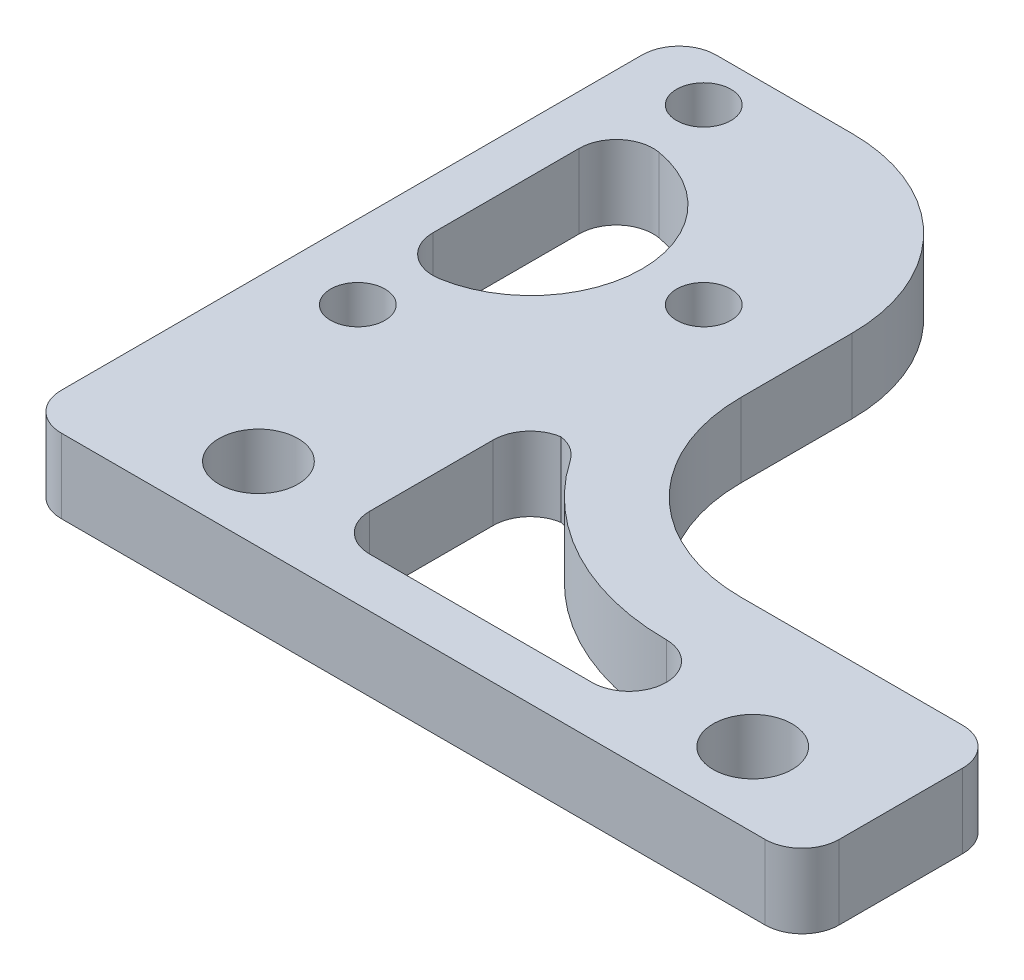
ISO-10303-21;
HEADER;
FILE_DESCRIPTION(('STEP AP214'),'2;1');
FILE_NAME('part.step','',(''),(''),'','','');
FILE_SCHEMA(('AUTOMOTIVE_DESIGN { 1 0 10303 214 1 1 1 1 }'));
ENDSEC;
DATA;
#1=APPLICATION_CONTEXT('core data for automotive mechanical design processes');
#2=APPLICATION_PROTOCOL_DEFINITION('international standard','automotive_design',2000,#1);
#3=PRODUCT_CONTEXT('',#1,'mechanical');
#4=PRODUCT('Part','Part','',(#3));
#5=PRODUCT_RELATED_PRODUCT_CATEGORY('part','',(#4));
#6=PRODUCT_DEFINITION_FORMATION('','',#4);
#7=PRODUCT_DEFINITION_CONTEXT('part definition',#1,'design');
#8=PRODUCT_DEFINITION('design','',#6,#7);
#9=PRODUCT_DEFINITION_SHAPE('','',#8);
#10=(LENGTH_UNIT() NAMED_UNIT(*) SI_UNIT(.MILLI.,.METRE.));
#11=(NAMED_UNIT(*) PLANE_ANGLE_UNIT() SI_UNIT($,.RADIAN.));
#12=(NAMED_UNIT(*) SI_UNIT($,.STERADIAN.) SOLID_ANGLE_UNIT());
#13=UNCERTAINTY_MEASURE_WITH_UNIT(LENGTH_MEASURE(1.E-05),#10,'distance_accuracy_value','');
#14=(GEOMETRIC_REPRESENTATION_CONTEXT(3) GLOBAL_UNCERTAINTY_ASSIGNED_CONTEXT((#13)) GLOBAL_UNIT_ASSIGNED_CONTEXT((#10,
#11,#12)) REPRESENTATION_CONTEXT('',''));
#15=CARTESIAN_POINT('',(0.,0.,0.));
#16=DIRECTION('',(0.,0.,1.));
#17=DIRECTION('',(1.,0.,0.));
#18=AXIS2_PLACEMENT_3D('',#15,#16,#17);
#19=CARTESIAN_POINT('',(0.,3.,0.));
#20=DIRECTION('',(0.,1.,0.));
#21=DIRECTION('',(0.,0.,1.));
#22=AXIS2_PLACEMENT_3D('',#19,#20,#21);
#23=PLANE('',#22);
#24=DIRECTION('',(0.,0.,1.));
#25=VECTOR('',#24,1.);
#26=CARTESIAN_POINT('',(7.48,3.,7.5));
#27=LINE('',#26,#25);
#28=CARTESIAN_POINT('',(7.48,3.,9.));
#29=VERTEX_POINT('',#28);
#30=CARTESIAN_POINT('',(7.48,3.,14.));
#31=VERTEX_POINT('',#30);
#32=EDGE_CURVE('E711',#29,#31,#27,.T.);
#33=ORIENTED_EDGE('',*,*,#32,.F.);
#34=CARTESIAN_POINT('',(8.98,3.,9.));
#35=DIRECTION('',(0.,1.,0.));
#36=DIRECTION('',(0.,0.,1.));
#37=AXIS2_PLACEMENT_3D('',#34,#35,#36);
#38=CIRCLE('',#37,1.5);
#39=CARTESIAN_POINT('',(8.74658350974743,3.,7.51827237925515));
#40=VERTEX_POINT('',#39);
#41=EDGE_CURVE('E53',#29,#40,#38,.F.);
#42=ORIENTED_EDGE('',*,*,#41,.T.);
#43=CARTESIAN_POINT('',(8.51316701949486,3.,9.));
#44=DIRECTION('',(0.,1.,0.));
#45=DIRECTION('',(0.,0.,1.));
#46=AXIS2_PLACEMENT_3D('',#43,#44,#45);
#47=CIRCLE('',#46,1.5);
#48=CARTESIAN_POINT('',(9.75058001695206,3.,8.15217391304348));
#49=VERTEX_POINT('',#48);
#50=EDGE_CURVE('E298',#40,#49,#47,.F.);
#51=ORIENTED_EDGE('',*,*,#50,.T.);
#52=CARTESIAN_POINT('',(18.,3.,2.5));
#53=DIRECTION('',(0.,-1.,0.));
#54=DIRECTION('',(0.,0.,1.));
#55=AXIS2_PLACEMENT_3D('',#52,#53,#54);
#56=CIRCLE('',#55,10.);
#57=CARTESIAN_POINT('',(17.9826086956522,3.,12.4999848771152));
#58=VERTEX_POINT('',#57);
#59=EDGE_CURVE('E258',#58,#49,#56,.T.);
#60=ORIENTED_EDGE('',*,*,#59,.F.);
#61=CARTESIAN_POINT('',(17.98,3.,13.9999826086825));
#62=DIRECTION('',(0.,1.,0.));
#63=DIRECTION('',(0.,0.,1.));
#64=AXIS2_PLACEMENT_3D('',#61,#62,#63);
#65=CIRCLE('',#64,1.5);
#66=CARTESIAN_POINT('',(19.48,3.,13.9999826086825));
#67=VERTEX_POINT('',#66);
#68=EDGE_CURVE('E315',#58,#67,#65,.F.);
#69=ORIENTED_EDGE('',*,*,#68,.T.);
#70=DIRECTION('',(0.,0.,-1.));
#71=VECTOR('',#70,1.);
#72=CARTESIAN_POINT('',(19.48,3.,15.5));
#73=LINE('',#72,#71);
#74=CARTESIAN_POINT('',(19.48,3.,14.));
#75=VERTEX_POINT('',#74);
#76=EDGE_CURVE('E703',#75,#67,#73,.T.);
#77=ORIENTED_EDGE('',*,*,#76,.F.);
#78=CARTESIAN_POINT('',(17.98,3.,14.));
#79=DIRECTION('',(0.,1.,0.));
#80=DIRECTION('',(0.,0.,1.));
#81=AXIS2_PLACEMENT_3D('',#78,#79,#80);
#82=CIRCLE('',#81,1.5);
#83=CARTESIAN_POINT('',(17.98,3.,15.5));
#84=VERTEX_POINT('',#83);
#85=EDGE_CURVE('E314',#75,#84,#82,.F.);
#86=ORIENTED_EDGE('',*,*,#85,.T.);
#87=DIRECTION('',(1.,0.,0.));
#88=VECTOR('',#87,1.);
#89=CARTESIAN_POINT('',(7.48,3.,15.5));
#90=LINE('',#89,#88);
#91=CARTESIAN_POINT('',(8.98,3.,15.5));
#92=VERTEX_POINT('',#91);
#93=EDGE_CURVE('E707',#92,#84,#90,.T.);
#94=ORIENTED_EDGE('',*,*,#93,.F.);
#95=CARTESIAN_POINT('',(8.98,3.,14.));
#96=DIRECTION('',(0.,1.,0.));
#97=DIRECTION('',(0.,0.,1.));
#98=AXIS2_PLACEMENT_3D('',#95,#96,#97);
#99=CIRCLE('',#98,1.5);
#100=EDGE_CURVE('E299',#92,#31,#99,.F.);
#101=ORIENTED_EDGE('',*,*,#100,.T.);
#102=EDGE_LOOP('',(#33,#42,#51,#60,#69,#77,#86,#94,#101));
#103=FACE_BOUND('',#102,.T.);
#104=DIRECTION('',(0.,0.,-1.));
#105=VECTOR('',#104,1.);
#106=CARTESIAN_POINT('',(28.48,3.,-9.));
#107=LINE('',#106,#105);
#108=CARTESIAN_POINT('',(28.48,3.,16.));
#109=VERTEX_POINT('',#108);
#110=CARTESIAN_POINT('',(28.48,3.,11.));
#111=VERTEX_POINT('',#110);
#112=EDGE_CURVE('E359',#109,#111,#107,.T.);
#113=ORIENTED_EDGE('',*,*,#112,.T.);
#114=CARTESIAN_POINT('',(26.98,3.,11.));
#115=DIRECTION('',(0.,1.,0.));
#116=DIRECTION('',(0.,0.,1.));
#117=AXIS2_PLACEMENT_3D('',#114,#115,#116);
#118=CIRCLE('',#117,1.5);
#119=CARTESIAN_POINT('',(26.98,3.,9.5));
#120=VERTEX_POINT('',#119);
#121=EDGE_CURVE('E239',#111,#120,#118,.T.);
#122=ORIENTED_EDGE('',*,*,#121,.T.);
#123=DIRECTION('',(1.,0.,0.));
#124=VECTOR('',#123,1.);
#125=CARTESIAN_POINT('',(11.,3.,9.5));
#126=LINE('',#125,#124);
#127=CARTESIAN_POINT('',(18.,3.,9.5));
#128=VERTEX_POINT('',#127);
#129=EDGE_CURVE('E229',#128,#120,#126,.T.);
#130=ORIENTED_EDGE('',*,*,#129,.F.);
#131=CARTESIAN_POINT('',(18.,3.,2.5));
#132=DIRECTION('',(0.,1.,0.));
#133=DIRECTION('',(0.,0.,1.));
#134=AXIS2_PLACEMENT_3D('',#131,#132,#133);
#135=CIRCLE('',#134,7.);
#136=CARTESIAN_POINT('',(11.,3.,2.5));
#137=VERTEX_POINT('',#136);
#138=EDGE_CURVE('E211',#128,#137,#135,.F.);
#139=ORIENTED_EDGE('',*,*,#138,.T.);
#140=DIRECTION('',(0.,0.,1.));
#141=VECTOR('',#140,1.);
#142=CARTESIAN_POINT('',(11.,3.,-9.));
#143=LINE('',#142,#141);
#144=CARTESIAN_POINT('',(11.,3.,-2.));
#145=VERTEX_POINT('',#144);
#146=EDGE_CURVE('E242',#145,#137,#143,.T.);
#147=ORIENTED_EDGE('',*,*,#146,.F.);
#148=CARTESIAN_POINT('',(4.,3.,-2.));
#149=DIRECTION('',(0.,1.,0.));
#150=DIRECTION('',(0.,0.,1.));
#151=AXIS2_PLACEMENT_3D('',#148,#149,#150);
#152=CIRCLE('',#151,7.);
#153=CARTESIAN_POINT('',(4.,3.,-9.));
#154=VERTEX_POINT('',#153);
#155=EDGE_CURVE('E223',#145,#154,#152,.T.);
#156=ORIENTED_EDGE('',*,*,#155,.T.);
#157=DIRECTION('',(-1.,0.,0.));
#158=VECTOR('',#157,1.);
#159=CARTESIAN_POINT('',(-3.,3.,-9.));
#160=LINE('',#159,#158);
#161=CARTESIAN_POINT('',(-1.5,3.,-9.));
#162=VERTEX_POINT('',#161);
#163=EDGE_CURVE('E347',#154,#162,#160,.T.);
#164=ORIENTED_EDGE('',*,*,#163,.T.);
#165=CARTESIAN_POINT('',(-1.5,3.,-7.5));
#166=DIRECTION('',(0.,1.,0.));
#167=DIRECTION('',(0.,0.,1.));
#168=AXIS2_PLACEMENT_3D('',#165,#166,#167);
#169=CIRCLE('',#168,1.5);
#170=CARTESIAN_POINT('',(-3.,3.,-7.5));
#171=VERTEX_POINT('',#170);
#172=EDGE_CURVE('E504',#162,#171,#169,.T.);
#173=ORIENTED_EDGE('',*,*,#172,.T.);
#174=DIRECTION('',(0.,0.,1.));
#175=VECTOR('',#174,1.);
#176=CARTESIAN_POINT('',(-3.,3.,-9.));
#177=LINE('',#176,#175);
#178=CARTESIAN_POINT('',(-3.,3.,16.));
#179=VERTEX_POINT('',#178);
#180=EDGE_CURVE('E587',#171,#179,#177,.T.);
#181=ORIENTED_EDGE('',*,*,#180,.T.);
#182=CARTESIAN_POINT('',(-1.5,3.,16.));
#183=DIRECTION('',(0.,1.,0.));
#184=DIRECTION('',(0.,0.,1.));
#185=AXIS2_PLACEMENT_3D('',#182,#183,#184);
#186=CIRCLE('',#185,1.5);
#187=CARTESIAN_POINT('',(-1.5,3.,17.5));
#188=VERTEX_POINT('',#187);
#189=EDGE_CURVE('E507',#179,#188,#186,.T.);
#190=ORIENTED_EDGE('',*,*,#189,.T.);
#191=DIRECTION('',(1.,0.,0.));
#192=VECTOR('',#191,1.);
#193=CARTESIAN_POINT('',(-3.,3.,17.5));
#194=LINE('',#193,#192);
#195=CARTESIAN_POINT('',(26.98,3.,17.5));
#196=VERTEX_POINT('',#195);
#197=EDGE_CURVE('E591',#188,#196,#194,.T.);
#198=ORIENTED_EDGE('',*,*,#197,.T.);
#199=CARTESIAN_POINT('',(26.98,3.,16.));
#200=DIRECTION('',(0.,1.,0.));
#201=DIRECTION('',(0.,0.,1.));
#202=AXIS2_PLACEMENT_3D('',#199,#200,#201);
#203=CIRCLE('',#202,1.5);
#204=EDGE_CURVE('E501',#196,#109,#203,.T.);
#205=ORIENTED_EDGE('',*,*,#204,.T.);
#206=EDGE_LOOP('',(#113,#122,#130,#139,#147,#156,#164,#173,#181,#190,#198,#205));
#207=FACE_BOUND('',#206,.T.);
#208=CARTESIAN_POINT('',(0.,3.,0.));
#209=DIRECTION('',(0.,1.,0.));
#210=DIRECTION('',(0.,0.,1.));
#211=AXIS2_PLACEMENT_3D('',#208,#209,#210);
#212=CIRCLE('',#211,4.5);
#213=CARTESIAN_POINT('',(0.75,3.,4.43705983732471));
#214=VERTEX_POINT('',#213);
#215=CARTESIAN_POINT('',(0.75,3.,-4.43705983732471));
#216=VERTEX_POINT('',#215);
#217=EDGE_CURVE('E254',#214,#216,#212,.T.);
#218=ORIENTED_EDGE('',*,*,#217,.F.);
#219=CARTESIAN_POINT('',(0.5,3.,2.95803989154981));
#220=DIRECTION('',(0.,1.,0.));
#221=DIRECTION('',(0.,0.,1.));
#222=AXIS2_PLACEMENT_3D('',#219,#220,#221);
#223=CIRCLE('',#222,1.5);
#224=CARTESIAN_POINT('',(-1.,3.,2.95803989154981));
#225=VERTEX_POINT('',#224);
#226=EDGE_CURVE('E565',#214,#225,#223,.F.);
#227=ORIENTED_EDGE('',*,*,#226,.T.);
#228=DIRECTION('',(0.,0.,1.));
#229=VECTOR('',#228,1.);
#230=CARTESIAN_POINT('',(-1.,3.,-4.38748219369606));
#231=LINE('',#230,#229);
#232=CARTESIAN_POINT('',(-1.,3.,-2.95803989154981));
#233=VERTEX_POINT('',#232);
#234=EDGE_CURVE('E250',#233,#225,#231,.T.);
#235=ORIENTED_EDGE('',*,*,#234,.F.);
#236=CARTESIAN_POINT('',(0.5,3.,-2.95803989154981));
#237=DIRECTION('',(0.,1.,0.));
#238=DIRECTION('',(0.,0.,1.));
#239=AXIS2_PLACEMENT_3D('',#236,#237,#238);
#240=CIRCLE('',#239,1.5);
#241=EDGE_CURVE('E572',#233,#216,#240,.F.);
#242=ORIENTED_EDGE('',*,*,#241,.T.);
#243=EDGE_LOOP('',(#218,#227,#235,#242));
#244=FACE_BOUND('',#243,.T.);
#245=CARTESIAN_POINT('',(3.48,3.,14.5));
#246=DIRECTION('',(0.,1.,0.));
#247=DIRECTION('',(0.,0.,1.));
#248=AXIS2_PLACEMENT_3D('',#245,#246,#247);
#249=CIRCLE('',#248,1.6);
#250=CARTESIAN_POINT('',(3.48,3.,16.1));
#251=VERTEX_POINT('',#250);
#252=EDGE_CURVE('E635',#251,#251,#249,.T.);
#253=ORIENTED_EDGE('',*,*,#252,.F.);
#254=EDGE_LOOP('',(#253));
#255=FACE_BOUND('',#254,.T.);
#256=CARTESIAN_POINT('',(7.,3.,0.));
#257=DIRECTION('',(0.,1.,0.));
#258=DIRECTION('',(0.,0.,1.));
#259=AXIS2_PLACEMENT_3D('',#256,#257,#258);
#260=CIRCLE('',#259,1.1);
#261=CARTESIAN_POINT('',(7.,3.,1.1));
#262=VERTEX_POINT('',#261);
#263=EDGE_CURVE('E619',#262,#262,#260,.T.);
#264=ORIENTED_EDGE('',*,*,#263,.F.);
#265=EDGE_LOOP('',(#264));
#266=FACE_BOUND('',#265,.T.);
#267=CARTESIAN_POINT('',(0.,3.,-7.));
#268=DIRECTION('',(0.,1.,0.));
#269=DIRECTION('',(0.,0.,1.));
#270=AXIS2_PLACEMENT_3D('',#267,#268,#269);
#271=CIRCLE('',#270,1.1);
#272=CARTESIAN_POINT('',(0.,3.,-5.9));
#273=VERTEX_POINT('',#272);
#274=EDGE_CURVE('E608',#273,#273,#271,.T.);
#275=ORIENTED_EDGE('',*,*,#274,.F.);
#276=EDGE_LOOP('',(#275));
#277=FACE_BOUND('',#276,.T.);
#278=CARTESIAN_POINT('',(0.,3.,7.));
#279=DIRECTION('',(0.,1.,0.));
#280=DIRECTION('',(0.,0.,1.));
#281=AXIS2_PLACEMENT_3D('',#278,#279,#280);
#282=CIRCLE('',#281,1.1);
#283=CARTESIAN_POINT('',(0.,3.,8.1));
#284=VERTEX_POINT('',#283);
#285=EDGE_CURVE('E626',#284,#284,#282,.T.);
#286=ORIENTED_EDGE('',*,*,#285,.F.);
#287=EDGE_LOOP('',(#286));
#288=FACE_BOUND('',#287,.T.);
#289=CARTESIAN_POINT('',(23.48,3.,14.5));
#290=DIRECTION('',(0.,1.,0.));
#291=DIRECTION('',(0.,0.,1.));
#292=AXIS2_PLACEMENT_3D('',#289,#290,#291);
#293=CIRCLE('',#292,1.6);
#294=CARTESIAN_POINT('',(23.48,3.,16.1));
#295=VERTEX_POINT('',#294);
#296=EDGE_CURVE('E642',#295,#295,#293,.T.);
#297=ORIENTED_EDGE('',*,*,#296,.F.);
#298=EDGE_LOOP('',(#297));
#299=FACE_BOUND('',#298,.T.);
#300=ADVANCED_FACE('F43',(#103,#207,#244,#255,#266,#277,#288,#299),#23,.T.);
#301=CARTESIAN_POINT('',(0.,0.,0.));
#302=DIRECTION('',(0.,1.,0.));
#303=DIRECTION('',(0.,0.,1.));
#304=AXIS2_PLACEMENT_3D('',#301,#302,#303);
#305=PLANE('',#304);
#306=DIRECTION('',(0.,0.,-1.));
#307=VECTOR('',#306,1.);
#308=CARTESIAN_POINT('',(19.48,0.,0.));
#309=LINE('',#308,#307);
#310=CARTESIAN_POINT('',(19.48,0.,14.));
#311=VERTEX_POINT('',#310);
#312=CARTESIAN_POINT('',(19.48,0.,13.9999826086825));
#313=VERTEX_POINT('',#312);
#314=EDGE_CURVE('E474',#311,#313,#309,.T.);
#315=ORIENTED_EDGE('',*,*,#314,.T.);
#316=CARTESIAN_POINT('',(17.98,0.,13.9999826086825));
#317=DIRECTION('',(0.,1.,0.));
#318=DIRECTION('',(0.,0.,1.));
#319=AXIS2_PLACEMENT_3D('',#316,#317,#318);
#320=CIRCLE('',#319,1.5);
#321=CARTESIAN_POINT('',(17.9826086956522,0.,12.4999848771152));
#322=VERTEX_POINT('',#321);
#323=EDGE_CURVE('E309',#313,#322,#320,.T.);
#324=ORIENTED_EDGE('',*,*,#323,.T.);
#325=CARTESIAN_POINT('',(18.,0.,2.5));
#326=DIRECTION('',(0.,1.,0.));
#327=DIRECTION('',(0.,0.,1.));
#328=AXIS2_PLACEMENT_3D('',#325,#326,#327);
#329=CIRCLE('',#328,10.);
#330=CARTESIAN_POINT('',(9.75058001695206,0.,8.15217391304348));
#331=VERTEX_POINT('',#330);
#332=EDGE_CURVE('E463',#322,#331,#329,.F.);
#333=ORIENTED_EDGE('',*,*,#332,.T.);
#334=CARTESIAN_POINT('',(8.51316701949486,0.,9.));
#335=DIRECTION('',(0.,1.,0.));
#336=DIRECTION('',(0.,0.,1.));
#337=AXIS2_PLACEMENT_3D('',#334,#335,#336);
#338=CIRCLE('',#337,1.5);
#339=CARTESIAN_POINT('',(8.74658350974743,0.,7.51827237925515));
#340=VERTEX_POINT('',#339);
#341=EDGE_CURVE('E59',#331,#340,#338,.T.);
#342=ORIENTED_EDGE('',*,*,#341,.T.);
#343=CARTESIAN_POINT('',(8.98,0.,9.));
#344=DIRECTION('',(0.,1.,0.));
#345=DIRECTION('',(0.,0.,1.));
#346=AXIS2_PLACEMENT_3D('',#343,#344,#345);
#347=CIRCLE('',#346,1.5);
#348=CARTESIAN_POINT('',(7.48,0.,9.));
#349=VERTEX_POINT('',#348);
#350=EDGE_CURVE('E12',#340,#349,#347,.T.);
#351=ORIENTED_EDGE('',*,*,#350,.T.);
#352=DIRECTION('',(0.,0.,1.));
#353=VECTOR('',#352,1.);
#354=CARTESIAN_POINT('',(7.48,0.,0.));
#355=LINE('',#354,#353);
#356=CARTESIAN_POINT('',(7.48,0.,14.));
#357=VERTEX_POINT('',#356);
#358=EDGE_CURVE('E277',#349,#357,#355,.T.);
#359=ORIENTED_EDGE('',*,*,#358,.T.);
#360=CARTESIAN_POINT('',(8.98,0.,14.));
#361=DIRECTION('',(0.,1.,0.));
#362=DIRECTION('',(0.,0.,1.));
#363=AXIS2_PLACEMENT_3D('',#360,#361,#362);
#364=CIRCLE('',#363,1.5);
#365=CARTESIAN_POINT('',(8.98,0.,15.5));
#366=VERTEX_POINT('',#365);
#367=EDGE_CURVE('E293',#357,#366,#364,.T.);
#368=ORIENTED_EDGE('',*,*,#367,.T.);
#369=DIRECTION('',(1.,0.,0.));
#370=VECTOR('',#369,1.);
#371=CARTESIAN_POINT('',(0.,0.,15.5));
#372=LINE('',#371,#370);
#373=CARTESIAN_POINT('',(17.98,0.,15.5));
#374=VERTEX_POINT('',#373);
#375=EDGE_CURVE('E283',#366,#374,#372,.T.);
#376=ORIENTED_EDGE('',*,*,#375,.T.);
#377=CARTESIAN_POINT('',(17.98,0.,14.));
#378=DIRECTION('',(0.,1.,0.));
#379=DIRECTION('',(0.,0.,1.));
#380=AXIS2_PLACEMENT_3D('',#377,#378,#379);
#381=CIRCLE('',#380,1.5);
#382=EDGE_CURVE('E318',#374,#311,#381,.T.);
#383=ORIENTED_EDGE('',*,*,#382,.T.);
#384=EDGE_LOOP('',(#315,#324,#333,#342,#351,#359,#368,#376,#383));
#385=FACE_BOUND('',#384,.T.);
#386=CARTESIAN_POINT('',(0.,0.,0.));
#387=DIRECTION('',(0.,1.,0.));
#388=DIRECTION('',(0.,0.,1.));
#389=AXIS2_PLACEMENT_3D('',#386,#387,#388);
#390=CIRCLE('',#389,4.5);
#391=CARTESIAN_POINT('',(0.75,0.,4.43705983732471));
#392=VERTEX_POINT('',#391);
#393=CARTESIAN_POINT('',(0.75,0.,-4.43705983732471));
#394=VERTEX_POINT('',#393);
#395=EDGE_CURVE('E235',#392,#394,#390,.T.);
#396=ORIENTED_EDGE('',*,*,#395,.T.);
#397=CARTESIAN_POINT('',(0.5,0.,-2.95803989154981));
#398=DIRECTION('',(0.,1.,0.));
#399=DIRECTION('',(0.,0.,1.));
#400=AXIS2_PLACEMENT_3D('',#397,#398,#399);
#401=CIRCLE('',#400,1.5);
#402=CARTESIAN_POINT('',(-1.,0.,-2.95803989154981));
#403=VERTEX_POINT('',#402);
#404=EDGE_CURVE('E688',#394,#403,#401,.T.);
#405=ORIENTED_EDGE('',*,*,#404,.T.);
#406=DIRECTION('',(0.,0.,1.));
#407=VECTOR('',#406,1.);
#408=CARTESIAN_POINT('',(-1.,0.,0.));
#409=LINE('',#408,#407);
#410=CARTESIAN_POINT('',(-1.,0.,2.95803989154981));
#411=VERTEX_POINT('',#410);
#412=EDGE_CURVE('E329',#403,#411,#409,.T.);
#413=ORIENTED_EDGE('',*,*,#412,.T.);
#414=CARTESIAN_POINT('',(0.5,0.,2.95803989154981));
#415=DIRECTION('',(0.,1.,0.));
#416=DIRECTION('',(0.,0.,1.));
#417=AXIS2_PLACEMENT_3D('',#414,#415,#416);
#418=CIRCLE('',#417,1.5);
#419=EDGE_CURVE('E568',#411,#392,#418,.T.);
#420=ORIENTED_EDGE('',*,*,#419,.T.);
#421=EDGE_LOOP('',(#396,#405,#413,#420));
#422=FACE_BOUND('',#421,.T.);
#423=DIRECTION('',(1.,0.,0.));
#424=VECTOR('',#423,1.);
#425=CARTESIAN_POINT('',(0.,0.,9.5));
#426=LINE('',#425,#424);
#427=CARTESIAN_POINT('',(18.,0.,9.5));
#428=VERTEX_POINT('',#427);
#429=CARTESIAN_POINT('',(26.98,0.,9.5));
#430=VERTEX_POINT('',#429);
#431=EDGE_CURVE('E232',#428,#430,#426,.T.);
#432=ORIENTED_EDGE('',*,*,#431,.T.);
#433=CARTESIAN_POINT('',(26.98,0.,11.));
#434=DIRECTION('',(0.,1.,0.));
#435=DIRECTION('',(0.,0.,1.));
#436=AXIS2_PLACEMENT_3D('',#433,#434,#435);
#437=CIRCLE('',#436,1.5);
#438=CARTESIAN_POINT('',(28.48,0.,11.));
#439=VERTEX_POINT('',#438);
#440=EDGE_CURVE('E524',#430,#439,#437,.F.);
#441=ORIENTED_EDGE('',*,*,#440,.T.);
#442=DIRECTION('',(0.,0.,-1.));
#443=VECTOR('',#442,1.);
#444=CARTESIAN_POINT('',(28.48,0.,-9.));
#445=LINE('',#444,#443);
#446=CARTESIAN_POINT('',(28.48,0.,16.));
#447=VERTEX_POINT('',#446);
#448=EDGE_CURVE('E579',#447,#439,#445,.T.);
#449=ORIENTED_EDGE('',*,*,#448,.F.);
#450=CARTESIAN_POINT('',(26.98,0.,16.));
#451=DIRECTION('',(0.,1.,0.));
#452=DIRECTION('',(0.,0.,1.));
#453=AXIS2_PLACEMENT_3D('',#450,#451,#452);
#454=CIRCLE('',#453,1.5);
#455=CARTESIAN_POINT('',(26.98,0.,17.5));
#456=VERTEX_POINT('',#455);
#457=EDGE_CURVE('E515',#447,#456,#454,.F.);
#458=ORIENTED_EDGE('',*,*,#457,.T.);
#459=DIRECTION('',(1.,0.,0.));
#460=VECTOR('',#459,1.);
#461=CARTESIAN_POINT('',(-3.,0.,17.5));
#462=LINE('',#461,#460);
#463=CARTESIAN_POINT('',(-1.5,0.,17.5));
#464=VERTEX_POINT('',#463);
#465=EDGE_CURVE('E582',#464,#456,#462,.T.);
#466=ORIENTED_EDGE('',*,*,#465,.F.);
#467=CARTESIAN_POINT('',(-1.5,0.,16.));
#468=DIRECTION('',(0.,1.,0.));
#469=DIRECTION('',(0.,0.,1.));
#470=AXIS2_PLACEMENT_3D('',#467,#468,#469);
#471=CIRCLE('',#470,1.5);
#472=CARTESIAN_POINT('',(-3.,0.,16.));
#473=VERTEX_POINT('',#472);
#474=EDGE_CURVE('E521',#464,#473,#471,.F.);
#475=ORIENTED_EDGE('',*,*,#474,.T.);
#476=DIRECTION('',(0.,0.,1.));
#477=VECTOR('',#476,1.);
#478=CARTESIAN_POINT('',(-3.,0.,-9.));
#479=LINE('',#478,#477);
#480=CARTESIAN_POINT('',(-3.,0.,-7.5));
#481=VERTEX_POINT('',#480);
#482=EDGE_CURVE('E604',#481,#473,#479,.T.);
#483=ORIENTED_EDGE('',*,*,#482,.F.);
#484=CARTESIAN_POINT('',(-1.5,0.,-7.5));
#485=DIRECTION('',(0.,1.,0.));
#486=DIRECTION('',(0.,0.,1.));
#487=AXIS2_PLACEMENT_3D('',#484,#485,#486);
#488=CIRCLE('',#487,1.5);
#489=CARTESIAN_POINT('',(-1.5,0.,-9.));
#490=VERTEX_POINT('',#489);
#491=EDGE_CURVE('E518',#481,#490,#488,.F.);
#492=ORIENTED_EDGE('',*,*,#491,.T.);
#493=DIRECTION('',(-1.,0.,0.));
#494=VECTOR('',#493,1.);
#495=CARTESIAN_POINT('',(-3.,0.,-9.));
#496=LINE('',#495,#494);
#497=CARTESIAN_POINT('',(4.,0.,-9.));
#498=VERTEX_POINT('',#497);
#499=EDGE_CURVE('E366',#498,#490,#496,.T.);
#500=ORIENTED_EDGE('',*,*,#499,.F.);
#501=CARTESIAN_POINT('',(4.,0.,-2.));
#502=DIRECTION('',(0.,1.,0.));
#503=DIRECTION('',(0.,0.,1.));
#504=AXIS2_PLACEMENT_3D('',#501,#502,#503);
#505=CIRCLE('',#504,7.);
#506=CARTESIAN_POINT('',(11.,0.,-2.));
#507=VERTEX_POINT('',#506);
#508=EDGE_CURVE('E340',#498,#507,#505,.F.);
#509=ORIENTED_EDGE('',*,*,#508,.T.);
#510=DIRECTION('',(0.,0.,1.));
#511=VECTOR('',#510,1.);
#512=CARTESIAN_POINT('',(11.,0.,0.));
#513=LINE('',#512,#511);
#514=CARTESIAN_POINT('',(11.,0.,2.5));
#515=VERTEX_POINT('',#514);
#516=EDGE_CURVE('E241',#507,#515,#513,.T.);
#517=ORIENTED_EDGE('',*,*,#516,.T.);
#518=CARTESIAN_POINT('',(18.,0.,2.5));
#519=DIRECTION('',(0.,1.,0.));
#520=DIRECTION('',(0.,0.,1.));
#521=AXIS2_PLACEMENT_3D('',#518,#519,#520);
#522=CIRCLE('',#521,7.);
#523=EDGE_CURVE('E222',#515,#428,#522,.T.);
#524=ORIENTED_EDGE('',*,*,#523,.T.);
#525=EDGE_LOOP('',(#432,#441,#449,#458,#466,#475,#483,#492,#500,#509,#517,#524));
#526=FACE_BOUND('',#525,.T.);
#527=CARTESIAN_POINT('',(0.,0.,-7.));
#528=DIRECTION('',(0.,1.,0.));
#529=DIRECTION('',(0.,0.,1.));
#530=AXIS2_PLACEMENT_3D('',#527,#528,#529);
#531=CIRCLE('',#530,1.1);
#532=CARTESIAN_POINT('',(0.,0.,-5.9));
#533=VERTEX_POINT('',#532);
#534=EDGE_CURVE('E599',#533,#533,#531,.T.);
#535=ORIENTED_EDGE('',*,*,#534,.T.);
#536=EDGE_LOOP('',(#535));
#537=FACE_BOUND('',#536,.T.);
#538=CARTESIAN_POINT('',(7.,0.,0.));
#539=DIRECTION('',(0.,1.,0.));
#540=DIRECTION('',(0.,0.,1.));
#541=AXIS2_PLACEMENT_3D('',#538,#539,#540);
#542=CIRCLE('',#541,1.1);
#543=CARTESIAN_POINT('',(7.,0.,1.1));
#544=VERTEX_POINT('',#543);
#545=EDGE_CURVE('E621',#544,#544,#542,.T.);
#546=ORIENTED_EDGE('',*,*,#545,.T.);
#547=EDGE_LOOP('',(#546));
#548=FACE_BOUND('',#547,.T.);
#549=CARTESIAN_POINT('',(0.,0.,7.));
#550=DIRECTION('',(0.,1.,0.));
#551=DIRECTION('',(0.,0.,1.));
#552=AXIS2_PLACEMENT_3D('',#549,#550,#551);
#553=CIRCLE('',#552,1.1);
#554=CARTESIAN_POINT('',(0.,0.,8.1));
#555=VERTEX_POINT('',#554);
#556=EDGE_CURVE('E630',#555,#555,#553,.T.);
#557=ORIENTED_EDGE('',*,*,#556,.T.);
#558=EDGE_LOOP('',(#557));
#559=FACE_BOUND('',#558,.T.);
#560=CARTESIAN_POINT('',(3.48,0.,14.5));
#561=DIRECTION('',(0.,1.,0.));
#562=DIRECTION('',(0.,0.,1.));
#563=AXIS2_PLACEMENT_3D('',#560,#561,#562);
#564=CIRCLE('',#563,1.6);
#565=CARTESIAN_POINT('',(3.48,0.,16.1));
#566=VERTEX_POINT('',#565);
#567=EDGE_CURVE('E637',#566,#566,#564,.T.);
#568=ORIENTED_EDGE('',*,*,#567,.T.);
#569=EDGE_LOOP('',(#568));
#570=FACE_BOUND('',#569,.T.);
#571=CARTESIAN_POINT('',(23.48,0.,14.5));
#572=DIRECTION('',(0.,1.,0.));
#573=DIRECTION('',(0.,0.,1.));
#574=AXIS2_PLACEMENT_3D('',#571,#572,#573);
#575=CIRCLE('',#574,1.6);
#576=CARTESIAN_POINT('',(23.48,0.,16.1));
#577=VERTEX_POINT('',#576);
#578=EDGE_CURVE('E644',#577,#577,#575,.T.);
#579=ORIENTED_EDGE('',*,*,#578,.T.);
#580=EDGE_LOOP('',(#579));
#581=FACE_BOUND('',#580,.T.);
#582=ADVANCED_FACE('F364',(#385,#422,#526,#537,#548,#559,#570,#581),#305,.F.);
#583=CARTESIAN_POINT('',(-3.,3.,-9.));
#584=DIRECTION('',(1.,0.,0.));
#585=DIRECTION('',(0.,0.,-1.));
#586=AXIS2_PLACEMENT_3D('',#583,#584,#585);
#587=PLANE('',#586);
#588=ORIENTED_EDGE('',*,*,#482,.T.);
#589=DIRECTION('',(0.,-1.,0.));
#590=VECTOR('',#589,1.);
#591=CARTESIAN_POINT('',(-3.,3.,16.));
#592=LINE('',#591,#590);
#593=EDGE_CURVE('E538',#473,#179,#592,.F.);
#594=ORIENTED_EDGE('',*,*,#593,.T.);
#595=ORIENTED_EDGE('',*,*,#180,.F.);
#596=DIRECTION('',(0.,-1.,0.));
#597=VECTOR('',#596,1.);
#598=CARTESIAN_POINT('',(-3.,3.,-7.5));
#599=LINE('',#598,#597);
#600=EDGE_CURVE('E534',#171,#481,#599,.T.);
#601=ORIENTED_EDGE('',*,*,#600,.T.);
#602=EDGE_LOOP('',(#588,#594,#595,#601));
#603=FACE_BOUND('',#602,.T.);
#604=ADVANCED_FACE('F387',(#603),#587,.F.);
#605=CARTESIAN_POINT('',(-3.,3.,17.5));
#606=DIRECTION('',(0.,0.,-1.));
#607=DIRECTION('',(-1.,0.,0.));
#608=AXIS2_PLACEMENT_3D('',#605,#606,#607);
#609=PLANE('',#608);
#610=ORIENTED_EDGE('',*,*,#197,.F.);
#611=DIRECTION('',(0.,-1.,0.));
#612=VECTOR('',#611,1.);
#613=CARTESIAN_POINT('',(-1.5,3.,17.5));
#614=LINE('',#613,#612);
#615=EDGE_CURVE('E530',#188,#464,#614,.T.);
#616=ORIENTED_EDGE('',*,*,#615,.T.);
#617=ORIENTED_EDGE('',*,*,#465,.T.);
#618=DIRECTION('',(0.,-1.,0.));
#619=VECTOR('',#618,1.);
#620=CARTESIAN_POINT('',(26.98,3.,17.5));
#621=LINE('',#620,#619);
#622=EDGE_CURVE('E527',#456,#196,#621,.F.);
#623=ORIENTED_EDGE('',*,*,#622,.T.);
#624=EDGE_LOOP('',(#610,#616,#617,#623));
#625=FACE_BOUND('',#624,.T.);
#626=ADVANCED_FACE('F398',(#625),#609,.F.);
#627=CARTESIAN_POINT('',(28.48,3.,-9.));
#628=DIRECTION('',(-1.,0.,0.));
#629=DIRECTION('',(0.,0.,1.));
#630=AXIS2_PLACEMENT_3D('',#627,#628,#629);
#631=PLANE('',#630);
#632=ORIENTED_EDGE('',*,*,#448,.T.);
#633=DIRECTION('',(0.,1.,0.));
#634=VECTOR('',#633,1.);
#635=CARTESIAN_POINT('',(28.48,3.,11.));
#636=LINE('',#635,#634);
#637=EDGE_CURVE('E497',#439,#111,#636,.T.);
#638=ORIENTED_EDGE('',*,*,#637,.T.);
#639=ORIENTED_EDGE('',*,*,#112,.F.);
#640=DIRECTION('',(0.,-1.,0.));
#641=VECTOR('',#640,1.);
#642=CARTESIAN_POINT('',(28.48,3.,16.));
#643=LINE('',#642,#641);
#644=EDGE_CURVE('E493',#109,#447,#643,.T.);
#645=ORIENTED_EDGE('',*,*,#644,.T.);
#646=EDGE_LOOP('',(#632,#638,#639,#645));
#647=FACE_BOUND('',#646,.T.);
#648=ADVANCED_FACE('F395',(#647),#631,.F.);
#649=CARTESIAN_POINT('',(-3.,3.,-9.));
#650=DIRECTION('',(0.,0.,1.));
#651=DIRECTION('',(1.,0.,0.));
#652=AXIS2_PLACEMENT_3D('',#649,#650,#651);
#653=PLANE('',#652);
#654=ORIENTED_EDGE('',*,*,#499,.T.);
#655=DIRECTION('',(0.,-1.,0.));
#656=VECTOR('',#655,1.);
#657=CARTESIAN_POINT('',(-1.5,3.,-9.));
#658=LINE('',#657,#656);
#659=EDGE_CURVE('E357',#490,#162,#658,.F.);
#660=ORIENTED_EDGE('',*,*,#659,.T.);
#661=ORIENTED_EDGE('',*,*,#163,.F.);
#662=DIRECTION('',(0.,-1.,0.));
#663=VECTOR('',#662,1.);
#664=CARTESIAN_POINT('',(4.,3.,-9.));
#665=LINE('',#664,#663);
#666=EDGE_CURVE('E336',#154,#498,#665,.T.);
#667=ORIENTED_EDGE('',*,*,#666,.T.);
#668=EDGE_LOOP('',(#654,#660,#661,#667));
#669=FACE_BOUND('',#668,.T.);
#670=ADVANCED_FACE('F354',(#669),#653,.F.);
#671=CARTESIAN_POINT('',(0.,3.,-7.));
#672=DIRECTION('',(0.,-1.,0.));
#673=DIRECTION('',(0.,0.,-1.));
#674=AXIS2_PLACEMENT_3D('',#671,#672,#673);
#675=CYLINDRICAL_SURFACE('',#674,1.1);
#676=ORIENTED_EDGE('',*,*,#274,.T.);
#677=EDGE_LOOP('',(#676));
#678=FACE_BOUND('',#677,.T.);
#679=ORIENTED_EDGE('',*,*,#534,.F.);
#680=EDGE_LOOP('',(#679));
#681=FACE_BOUND('',#680,.T.);
#682=ADVANCED_FACE('F390',(#678,#681),#675,.F.);
#683=CARTESIAN_POINT('',(7.,3.,0.));
#684=DIRECTION('',(0.,-1.,0.));
#685=DIRECTION('',(0.,0.,-1.));
#686=AXIS2_PLACEMENT_3D('',#683,#684,#685);
#687=CYLINDRICAL_SURFACE('',#686,1.1);
#688=ORIENTED_EDGE('',*,*,#263,.T.);
#689=EDGE_LOOP('',(#688));
#690=FACE_BOUND('',#689,.T.);
#691=ORIENTED_EDGE('',*,*,#545,.F.);
#692=EDGE_LOOP('',(#691));
#693=FACE_BOUND('',#692,.T.);
#694=ADVANCED_FACE('F667',(#690,#693),#687,.F.);
#695=CARTESIAN_POINT('',(0.,3.,7.));
#696=DIRECTION('',(0.,-1.,0.));
#697=DIRECTION('',(0.,0.,-1.));
#698=AXIS2_PLACEMENT_3D('',#695,#696,#697);
#699=CYLINDRICAL_SURFACE('',#698,1.1);
#700=ORIENTED_EDGE('',*,*,#285,.T.);
#701=EDGE_LOOP('',(#700));
#702=FACE_BOUND('',#701,.T.);
#703=ORIENTED_EDGE('',*,*,#556,.F.);
#704=EDGE_LOOP('',(#703));
#705=FACE_BOUND('',#704,.T.);
#706=ADVANCED_FACE('F662',(#702,#705),#699,.F.);
#707=CARTESIAN_POINT('',(3.48,3.,14.5));
#708=DIRECTION('',(0.,-1.,0.));
#709=DIRECTION('',(0.,0.,-1.));
#710=AXIS2_PLACEMENT_3D('',#707,#708,#709);
#711=CYLINDRICAL_SURFACE('',#710,1.6);
#712=ORIENTED_EDGE('',*,*,#252,.T.);
#713=EDGE_LOOP('',(#712));
#714=FACE_BOUND('',#713,.T.);
#715=ORIENTED_EDGE('',*,*,#567,.F.);
#716=EDGE_LOOP('',(#715));
#717=FACE_BOUND('',#716,.T.);
#718=ADVANCED_FACE('F655',(#714,#717),#711,.F.);
#719=CARTESIAN_POINT('',(23.48,3.,14.5));
#720=DIRECTION('',(0.,-1.,0.));
#721=DIRECTION('',(0.,0.,-1.));
#722=AXIS2_PLACEMENT_3D('',#719,#720,#721);
#723=CYLINDRICAL_SURFACE('',#722,1.6);
#724=ORIENTED_EDGE('',*,*,#296,.T.);
#725=EDGE_LOOP('',(#724));
#726=FACE_BOUND('',#725,.T.);
#727=ORIENTED_EDGE('',*,*,#578,.F.);
#728=EDGE_LOOP('',(#727));
#729=FACE_BOUND('',#728,.T.);
#730=ADVANCED_FACE('F379',(#726,#729),#723,.F.);
#731=CARTESIAN_POINT('',(11.,-18.5,9.5));
#732=DIRECTION('',(0.,0.,1.));
#733=DIRECTION('',(1.,0.,0.));
#734=AXIS2_PLACEMENT_3D('',#731,#732,#733);
#735=PLANE('',#734);
#736=ORIENTED_EDGE('',*,*,#129,.T.);
#737=DIRECTION('',(0.,1.,0.));
#738=VECTOR('',#737,1.);
#739=CARTESIAN_POINT('',(26.98,-18.5,9.5));
#740=LINE('',#739,#738);
#741=EDGE_CURVE('E512',#120,#430,#740,.F.);
#742=ORIENTED_EDGE('',*,*,#741,.T.);
#743=ORIENTED_EDGE('',*,*,#431,.F.);
#744=DIRECTION('',(0.,1.,0.));
#745=VECTOR('',#744,1.);
#746=CARTESIAN_POINT('',(18.,3.,9.5));
#747=LINE('',#746,#745);
#748=EDGE_CURVE('E215',#428,#128,#747,.T.);
#749=ORIENTED_EDGE('',*,*,#748,.T.);
#750=EDGE_LOOP('',(#736,#742,#743,#749));
#751=FACE_BOUND('',#750,.T.);
#752=ADVANCED_FACE('F228',(#751),#735,.F.);
#753=CARTESIAN_POINT('',(11.,-18.5,-9.));
#754=DIRECTION('',(-1.,0.,0.));
#755=DIRECTION('',(0.,0.,1.));
#756=AXIS2_PLACEMENT_3D('',#753,#754,#755);
#757=PLANE('',#756);
#758=ORIENTED_EDGE('',*,*,#146,.T.);
#759=DIRECTION('',(0.,1.,0.));
#760=VECTOR('',#759,1.);
#761=CARTESIAN_POINT('',(11.,0.,2.5));
#762=LINE('',#761,#760);
#763=EDGE_CURVE('E216',#137,#515,#762,.F.);
#764=ORIENTED_EDGE('',*,*,#763,.T.);
#765=ORIENTED_EDGE('',*,*,#516,.F.);
#766=DIRECTION('',(0.,-1.,0.));
#767=VECTOR('',#766,1.);
#768=CARTESIAN_POINT('',(11.,-18.5,-2.));
#769=LINE('',#768,#767);
#770=EDGE_CURVE('E234',#507,#145,#769,.F.);
#771=ORIENTED_EDGE('',*,*,#770,.T.);
#772=EDGE_LOOP('',(#758,#764,#765,#771));
#773=FACE_BOUND('',#772,.T.);
#774=ADVANCED_FACE('F368',(#773),#757,.F.);
#775=CARTESIAN_POINT('',(0.,-18.5,0.));
#776=DIRECTION('',(0.,1.,0.));
#777=DIRECTION('',(0.,0.,1.));
#778=AXIS2_PLACEMENT_3D('',#775,#776,#777);
#779=CYLINDRICAL_SURFACE('',#778,4.5);
#780=ORIENTED_EDGE('',*,*,#395,.F.);
#781=DIRECTION('',(0.,1.,0.));
#782=VECTOR('',#781,1.);
#783=CARTESIAN_POINT('',(0.75,-18.5,4.43705983732471));
#784=LINE('',#783,#782);
#785=EDGE_CURVE('E478',#392,#214,#784,.T.);
#786=ORIENTED_EDGE('',*,*,#785,.T.);
#787=ORIENTED_EDGE('',*,*,#217,.T.);
#788=DIRECTION('',(0.,1.,0.));
#789=VECTOR('',#788,1.);
#790=CARTESIAN_POINT('',(0.75,-18.5,-4.43705983732471));
#791=LINE('',#790,#789);
#792=EDGE_CURVE('E473',#216,#394,#791,.F.);
#793=ORIENTED_EDGE('',*,*,#792,.T.);
#794=EDGE_LOOP('',(#780,#786,#787,#793));
#795=FACE_BOUND('',#794,.T.);
#796=ADVANCED_FACE('F370',(#795),#779,.F.);
#797=CARTESIAN_POINT('',(-1.,-18.5,-4.38748219369606));
#798=DIRECTION('',(-1.,0.,0.));
#799=DIRECTION('',(0.,0.,1.));
#800=AXIS2_PLACEMENT_3D('',#797,#798,#799);
#801=PLANE('',#800);
#802=ORIENTED_EDGE('',*,*,#234,.T.);
#803=DIRECTION('',(0.,-1.,0.));
#804=VECTOR('',#803,1.);
#805=CARTESIAN_POINT('',(-1.,0.,2.95803989154981));
#806=LINE('',#805,#804);
#807=EDGE_CURVE('E490',#225,#411,#806,.T.);
#808=ORIENTED_EDGE('',*,*,#807,.T.);
#809=ORIENTED_EDGE('',*,*,#412,.F.);
#810=DIRECTION('',(0.,-1.,0.));
#811=VECTOR('',#810,1.);
#812=CARTESIAN_POINT('',(-1.,3.,-2.95803989154981));
#813=LINE('',#812,#811);
#814=EDGE_CURVE('E486',#403,#233,#813,.F.);
#815=ORIENTED_EDGE('',*,*,#814,.T.);
#816=EDGE_LOOP('',(#802,#808,#809,#815));
#817=FACE_BOUND('',#816,.T.);
#818=ADVANCED_FACE('F376',(#817),#801,.F.);
#819=CARTESIAN_POINT('',(18.,-18.5,2.5));
#820=DIRECTION('',(0.,-1.,0.));
#821=DIRECTION('',(0.,0.,-1.));
#822=AXIS2_PLACEMENT_3D('',#819,#820,#821);
#823=CYLINDRICAL_SURFACE('',#822,7.);
#824=ORIENTED_EDGE('',*,*,#523,.F.);
#825=ORIENTED_EDGE('',*,*,#763,.F.);
#826=ORIENTED_EDGE('',*,*,#138,.F.);
#827=ORIENTED_EDGE('',*,*,#748,.F.);
#828=EDGE_LOOP('',(#824,#825,#826,#827));
#829=FACE_BOUND('',#828,.T.);
#830=ADVANCED_FACE('F214',(#829),#823,.F.);
#831=CARTESIAN_POINT('',(4.,3.,-2.));
#832=DIRECTION('',(0.,-1.,0.));
#833=DIRECTION('',(0.,0.,-1.));
#834=AXIS2_PLACEMENT_3D('',#831,#832,#833);
#835=CYLINDRICAL_SURFACE('',#834,7.);
#836=ORIENTED_EDGE('',*,*,#155,.F.);
#837=ORIENTED_EDGE('',*,*,#770,.F.);
#838=ORIENTED_EDGE('',*,*,#508,.F.);
#839=ORIENTED_EDGE('',*,*,#666,.F.);
#840=EDGE_LOOP('',(#836,#837,#838,#839));
#841=FACE_BOUND('',#840,.T.);
#842=ADVANCED_FACE('F361',(#841),#835,.T.);
#843=CARTESIAN_POINT('',(18.,-18.5,2.5));
#844=DIRECTION('',(0.,1.,0.));
#845=DIRECTION('',(0.,0.,1.));
#846=AXIS2_PLACEMENT_3D('',#843,#844,#845);
#847=CYLINDRICAL_SURFACE('',#846,10.);
#848=ORIENTED_EDGE('',*,*,#332,.F.);
#849=DIRECTION('',(0.,1.,0.));
#850=VECTOR('',#849,1.);
#851=CARTESIAN_POINT('',(17.9826086956522,-18.5,12.4999848771152));
#852=LINE('',#851,#850);
#853=EDGE_CURVE('E467',#322,#58,#852,.T.);
#854=ORIENTED_EDGE('',*,*,#853,.T.);
#855=ORIENTED_EDGE('',*,*,#59,.T.);
#856=DIRECTION('',(0.,1.,0.));
#857=VECTOR('',#856,1.);
#858=CARTESIAN_POINT('',(9.75058001695205,-18.5,8.15217391304348));
#859=LINE('',#858,#857);
#860=EDGE_CURVE('E458',#49,#331,#859,.F.);
#861=ORIENTED_EDGE('',*,*,#860,.T.);
#862=EDGE_LOOP('',(#848,#854,#855,#861));
#863=FACE_BOUND('',#862,.T.);
#864=ADVANCED_FACE('F410',(#863),#847,.T.);
#865=CARTESIAN_POINT('',(19.48,-18.5,15.5));
#866=DIRECTION('',(1.,0.,0.));
#867=DIRECTION('',(0.,0.,-1.));
#868=AXIS2_PLACEMENT_3D('',#865,#866,#867);
#869=PLANE('',#868);
#870=ORIENTED_EDGE('',*,*,#76,.T.);
#871=DIRECTION('',(0.,-1.,0.));
#872=VECTOR('',#871,1.);
#873=CARTESIAN_POINT('',(19.48,0.,13.9999826086825));
#874=LINE('',#873,#872);
#875=EDGE_CURVE('E549',#67,#313,#874,.T.);
#876=ORIENTED_EDGE('',*,*,#875,.T.);
#877=ORIENTED_EDGE('',*,*,#314,.F.);
#878=DIRECTION('',(0.,1.,0.));
#879=VECTOR('',#878,1.);
#880=CARTESIAN_POINT('',(19.48,3.,14.));
#881=LINE('',#880,#879);
#882=EDGE_CURVE('E545',#311,#75,#881,.T.);
#883=ORIENTED_EDGE('',*,*,#882,.T.);
#884=EDGE_LOOP('',(#870,#876,#877,#883));
#885=FACE_BOUND('',#884,.T.);
#886=ADVANCED_FACE('F702',(#885),#869,.F.);
#887=CARTESIAN_POINT('',(7.48,-18.5,15.5));
#888=DIRECTION('',(0.,0.,1.));
#889=DIRECTION('',(1.,0.,0.));
#890=AXIS2_PLACEMENT_3D('',#887,#888,#889);
#891=PLANE('',#890);
#892=ORIENTED_EDGE('',*,*,#93,.T.);
#893=DIRECTION('',(0.,1.,0.));
#894=VECTOR('',#893,1.);
#895=CARTESIAN_POINT('',(17.98,0.,15.5));
#896=LINE('',#895,#894);
#897=EDGE_CURVE('E556',#84,#374,#896,.F.);
#898=ORIENTED_EDGE('',*,*,#897,.T.);
#899=ORIENTED_EDGE('',*,*,#375,.F.);
#900=DIRECTION('',(0.,1.,0.));
#901=VECTOR('',#900,1.);
#902=CARTESIAN_POINT('',(8.98,3.,15.5));
#903=LINE('',#902,#901);
#904=EDGE_CURVE('E552',#366,#92,#903,.T.);
#905=ORIENTED_EDGE('',*,*,#904,.T.);
#906=EDGE_LOOP('',(#892,#898,#899,#905));
#907=FACE_BOUND('',#906,.T.);
#908=ADVANCED_FACE('F720',(#907),#891,.F.);
#909=CARTESIAN_POINT('',(7.48,-18.5,7.5));
#910=DIRECTION('',(-1.,0.,0.));
#911=DIRECTION('',(0.,0.,1.));
#912=AXIS2_PLACEMENT_3D('',#909,#910,#911);
#913=PLANE('',#912);
#914=ORIENTED_EDGE('',*,*,#32,.T.);
#915=DIRECTION('',(0.,1.,0.));
#916=VECTOR('',#915,1.);
#917=CARTESIAN_POINT('',(7.48,0.,14.));
#918=LINE('',#917,#916);
#919=EDGE_CURVE('E562',#31,#357,#918,.F.);
#920=ORIENTED_EDGE('',*,*,#919,.T.);
#921=ORIENTED_EDGE('',*,*,#358,.F.);
#922=DIRECTION('',(0.,1.,0.));
#923=VECTOR('',#922,1.);
#924=CARTESIAN_POINT('',(7.48,3.,9.));
#925=LINE('',#924,#923);
#926=EDGE_CURVE('E559',#349,#29,#925,.T.);
#927=ORIENTED_EDGE('',*,*,#926,.T.);
#928=EDGE_LOOP('',(#914,#920,#921,#927));
#929=FACE_BOUND('',#928,.T.);
#930=ADVANCED_FACE('F415',(#929),#913,.F.);
#931=CARTESIAN_POINT('',(0.5,-18.5,2.95803989154981));
#932=DIRECTION('',(0.,1.,0.));
#933=DIRECTION('',(0.,0.,1.));
#934=AXIS2_PLACEMENT_3D('',#931,#932,#933);
#935=CYLINDRICAL_SURFACE('',#934,1.5);
#936=ORIENTED_EDGE('',*,*,#419,.F.);
#937=ORIENTED_EDGE('',*,*,#807,.F.);
#938=ORIENTED_EDGE('',*,*,#226,.F.);
#939=ORIENTED_EDGE('',*,*,#785,.F.);
#940=EDGE_LOOP('',(#936,#937,#938,#939));
#941=FACE_BOUND('',#940,.T.);
#942=ADVANCED_FACE('F411',(#941),#935,.F.);
#943=CARTESIAN_POINT('',(0.5,-18.5,-2.95803989154981));
#944=DIRECTION('',(0.,1.,0.));
#945=DIRECTION('',(0.,0.,1.));
#946=AXIS2_PLACEMENT_3D('',#943,#944,#945);
#947=CYLINDRICAL_SURFACE('',#946,1.5);
#948=ORIENTED_EDGE('',*,*,#404,.F.);
#949=ORIENTED_EDGE('',*,*,#792,.F.);
#950=ORIENTED_EDGE('',*,*,#241,.F.);
#951=ORIENTED_EDGE('',*,*,#814,.F.);
#952=EDGE_LOOP('',(#948,#949,#950,#951));
#953=FACE_BOUND('',#952,.T.);
#954=ADVANCED_FACE('F414',(#953),#947,.F.);
#955=CARTESIAN_POINT('',(26.98,3.,11.));
#956=DIRECTION('',(0.,1.,0.));
#957=DIRECTION('',(0.,0.,1.));
#958=AXIS2_PLACEMENT_3D('',#955,#956,#957);
#959=CYLINDRICAL_SURFACE('',#958,1.5);
#960=ORIENTED_EDGE('',*,*,#440,.F.);
#961=ORIENTED_EDGE('',*,*,#741,.F.);
#962=ORIENTED_EDGE('',*,*,#121,.F.);
#963=ORIENTED_EDGE('',*,*,#637,.F.);
#964=EDGE_LOOP('',(#960,#961,#962,#963));
#965=FACE_BOUND('',#964,.T.);
#966=ADVANCED_FACE('F419',(#965),#959,.T.);
#967=CARTESIAN_POINT('',(-1.5,3.,16.));
#968=DIRECTION('',(0.,-1.,0.));
#969=DIRECTION('',(0.,0.,-1.));
#970=AXIS2_PLACEMENT_3D('',#967,#968,#969);
#971=CYLINDRICAL_SURFACE('',#970,1.5);
#972=ORIENTED_EDGE('',*,*,#189,.F.);
#973=ORIENTED_EDGE('',*,*,#593,.F.);
#974=ORIENTED_EDGE('',*,*,#474,.F.);
#975=ORIENTED_EDGE('',*,*,#615,.F.);
#976=EDGE_LOOP('',(#972,#973,#974,#975));
#977=FACE_BOUND('',#976,.T.);
#978=ADVANCED_FACE('F423',(#977),#971,.T.);
#979=CARTESIAN_POINT('',(-1.5,3.,-7.5));
#980=DIRECTION('',(0.,-1.,0.));
#981=DIRECTION('',(0.,0.,-1.));
#982=AXIS2_PLACEMENT_3D('',#979,#980,#981);
#983=CYLINDRICAL_SURFACE('',#982,1.5);
#984=ORIENTED_EDGE('',*,*,#172,.F.);
#985=ORIENTED_EDGE('',*,*,#659,.F.);
#986=ORIENTED_EDGE('',*,*,#491,.F.);
#987=ORIENTED_EDGE('',*,*,#600,.F.);
#988=EDGE_LOOP('',(#984,#985,#986,#987));
#989=FACE_BOUND('',#988,.T.);
#990=ADVANCED_FACE('F427',(#989),#983,.T.);
#991=CARTESIAN_POINT('',(26.98,3.,16.));
#992=DIRECTION('',(0.,-1.,0.));
#993=DIRECTION('',(0.,0.,-1.));
#994=AXIS2_PLACEMENT_3D('',#991,#992,#993);
#995=CYLINDRICAL_SURFACE('',#994,1.5);
#996=ORIENTED_EDGE('',*,*,#204,.F.);
#997=ORIENTED_EDGE('',*,*,#622,.F.);
#998=ORIENTED_EDGE('',*,*,#457,.F.);
#999=ORIENTED_EDGE('',*,*,#644,.F.);
#1000=EDGE_LOOP('',(#996,#997,#998,#999));
#1001=FACE_BOUND('',#1000,.T.);
#1002=ADVANCED_FACE('F431',(#1001),#995,.T.);
#1003=CARTESIAN_POINT('',(17.98,-18.5,13.9999826086825));
#1004=DIRECTION('',(0.,1.,0.));
#1005=DIRECTION('',(0.,0.,1.));
#1006=AXIS2_PLACEMENT_3D('',#1003,#1004,#1005);
#1007=CYLINDRICAL_SURFACE('',#1006,1.5);
#1008=ORIENTED_EDGE('',*,*,#323,.F.);
#1009=ORIENTED_EDGE('',*,*,#875,.F.);
#1010=ORIENTED_EDGE('',*,*,#68,.F.);
#1011=ORIENTED_EDGE('',*,*,#853,.F.);
#1012=EDGE_LOOP('',(#1008,#1009,#1010,#1011));
#1013=FACE_BOUND('',#1012,.T.);
#1014=ADVANCED_FACE('F435',(#1013),#1007,.F.);
#1015=CARTESIAN_POINT('',(17.98,-18.5,14.));
#1016=DIRECTION('',(0.,-1.,0.));
#1017=DIRECTION('',(0.,0.,-1.));
#1018=AXIS2_PLACEMENT_3D('',#1015,#1016,#1017);
#1019=CYLINDRICAL_SURFACE('',#1018,1.5);
#1020=ORIENTED_EDGE('',*,*,#382,.F.);
#1021=ORIENTED_EDGE('',*,*,#897,.F.);
#1022=ORIENTED_EDGE('',*,*,#85,.F.);
#1023=ORIENTED_EDGE('',*,*,#882,.F.);
#1024=EDGE_LOOP('',(#1020,#1021,#1022,#1023));
#1025=FACE_BOUND('',#1024,.T.);
#1026=ADVANCED_FACE('F439',(#1025),#1019,.F.);
#1027=CARTESIAN_POINT('',(8.98,-18.5,14.));
#1028=DIRECTION('',(0.,-1.,0.));
#1029=DIRECTION('',(0.,0.,-1.));
#1030=AXIS2_PLACEMENT_3D('',#1027,#1028,#1029);
#1031=CYLINDRICAL_SURFACE('',#1030,1.5);
#1032=ORIENTED_EDGE('',*,*,#367,.F.);
#1033=ORIENTED_EDGE('',*,*,#919,.F.);
#1034=ORIENTED_EDGE('',*,*,#100,.F.);
#1035=ORIENTED_EDGE('',*,*,#904,.F.);
#1036=EDGE_LOOP('',(#1032,#1033,#1034,#1035));
#1037=FACE_BOUND('',#1036,.T.);
#1038=ADVANCED_FACE('F443',(#1037),#1031,.F.);
#1039=CARTESIAN_POINT('',(8.98,-18.5,9.));
#1040=DIRECTION('',(0.,-1.,0.));
#1041=DIRECTION('',(0.,0.,-1.));
#1042=AXIS2_PLACEMENT_3D('',#1039,#1040,#1041);
#1043=CYLINDRICAL_SURFACE('',#1042,1.5);
#1044=ORIENTED_EDGE('',*,*,#926,.F.);
#1045=ORIENTED_EDGE('',*,*,#350,.F.);
#1046=DIRECTION('',(0.,-1.,0.));
#1047=VECTOR('',#1046,1.);
#1048=CARTESIAN_POINT('',(8.74658350974743,1.5,7.51827237925515));
#1049=LINE('',#1048,#1047);
#1050=EDGE_CURVE('E47',#40,#340,#1049,.T.);
#1051=ORIENTED_EDGE('',*,*,#1050,.F.);
#1052=ORIENTED_EDGE('',*,*,#41,.F.);
#1053=EDGE_LOOP('',(#1044,#1045,#1051,#1052));
#1054=FACE_BOUND('',#1053,.T.);
#1055=ADVANCED_FACE('F45',(#1054),#1043,.F.);
#1056=CARTESIAN_POINT('',(8.51316701949486,-18.5,9.));
#1057=DIRECTION('',(0.,1.,0.));
#1058=DIRECTION('',(0.,0.,1.));
#1059=AXIS2_PLACEMENT_3D('',#1056,#1057,#1058);
#1060=CYLINDRICAL_SURFACE('',#1059,1.5);
#1061=ORIENTED_EDGE('',*,*,#341,.F.);
#1062=ORIENTED_EDGE('',*,*,#860,.F.);
#1063=ORIENTED_EDGE('',*,*,#50,.F.);
#1064=ORIENTED_EDGE('',*,*,#1050,.T.);
#1065=EDGE_LOOP('',(#1061,#1062,#1063,#1064));
#1066=FACE_BOUND('',#1065,.T.);
#1067=ADVANCED_FACE('F447',(#1066),#1060,.F.);
#1068=CLOSED_SHELL('',(#300,#582,#604,#626,#648,#670,#682,#694,#706,#718,#730,#752,#774,#796,
#818,#830,#842,#864,#886,#908,#930,#942,#954,#966,#978,#990,#1002,#1014,#1026,#1038,#1055,#1067));
#1069=MANIFOLD_SOLID_BREP('B2',#1068);
#1070=ADVANCED_BREP_SHAPE_REPRESENTATION('',(#18,#1069),#14);
#1071=SHAPE_DEFINITION_REPRESENTATION(#9,#1070);
ENDSEC;
END-ISO-10303-21;
